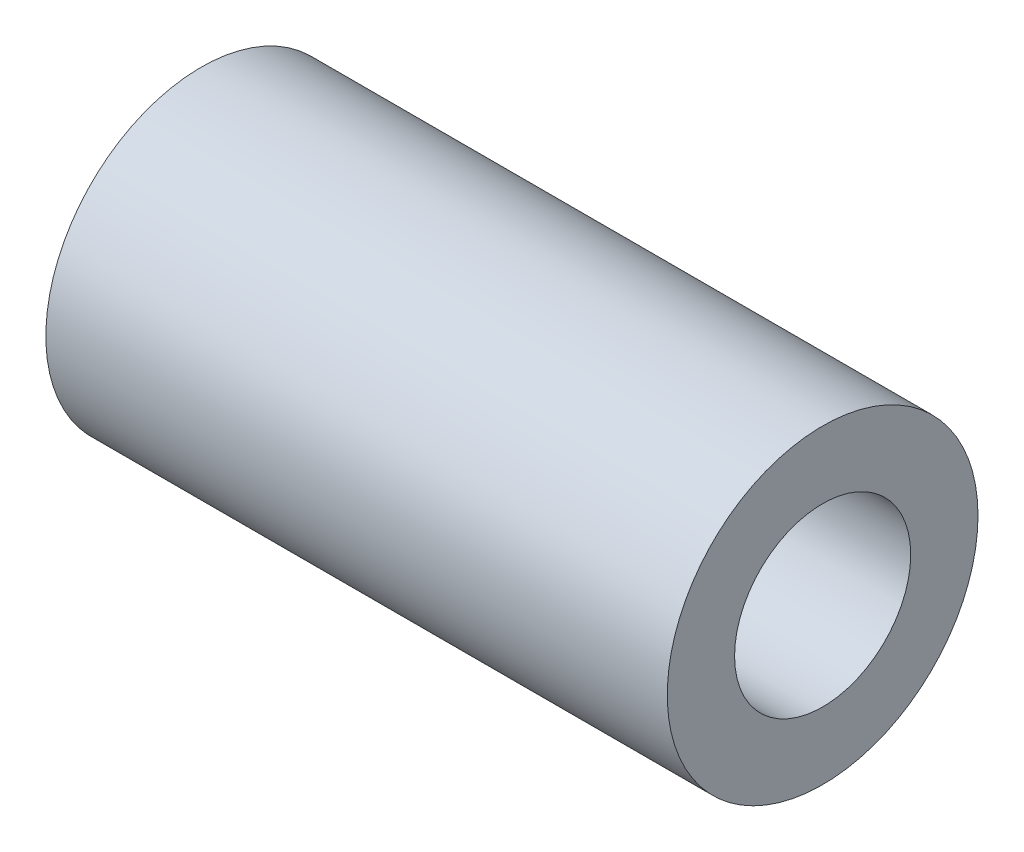
ISO-10303-21;
HEADER;
FILE_DESCRIPTION(('STEP AP214'),'2;1');
FILE_NAME('part.step','',(''),(''),'','','');
FILE_SCHEMA(('AUTOMOTIVE_DESIGN { 1 0 10303 214 1 1 1 1 }'));
ENDSEC;
DATA;
#1=APPLICATION_CONTEXT('core data for automotive mechanical design processes');
#2=APPLICATION_PROTOCOL_DEFINITION('international standard','automotive_design',2000,#1);
#3=PRODUCT_CONTEXT('',#1,'mechanical');
#4=PRODUCT('Part','Part','',(#3));
#5=PRODUCT_RELATED_PRODUCT_CATEGORY('part','',(#4));
#6=PRODUCT_DEFINITION_FORMATION('','',#4);
#7=PRODUCT_DEFINITION_CONTEXT('part definition',#1,'design');
#8=PRODUCT_DEFINITION('design','',#6,#7);
#9=PRODUCT_DEFINITION_SHAPE('','',#8);
#10=(LENGTH_UNIT() NAMED_UNIT(*) SI_UNIT(.MILLI.,.METRE.));
#11=(NAMED_UNIT(*) PLANE_ANGLE_UNIT() SI_UNIT($,.RADIAN.));
#12=(NAMED_UNIT(*) SI_UNIT($,.STERADIAN.) SOLID_ANGLE_UNIT());
#13=UNCERTAINTY_MEASURE_WITH_UNIT(LENGTH_MEASURE(1.E-05),#10,'distance_accuracy_value','');
#14=(GEOMETRIC_REPRESENTATION_CONTEXT(3) GLOBAL_UNCERTAINTY_ASSIGNED_CONTEXT((#13)) GLOBAL_UNIT_ASSIGNED_CONTEXT((#10,
#11,#12)) REPRESENTATION_CONTEXT('',''));
#15=CARTESIAN_POINT('',(0.,0.,0.));
#16=DIRECTION('',(0.,0.,1.));
#17=DIRECTION('',(1.,0.,0.));
#18=AXIS2_PLACEMENT_3D('',#15,#16,#17);
#19=CARTESIAN_POINT('',(12.7,0.,0.));
#20=DIRECTION('',(1.,0.,0.));
#21=DIRECTION('',(0.,0.,-1.));
#22=AXIS2_PLACEMENT_3D('',#19,#20,#21);
#23=PLANE('',#22);
#24=CARTESIAN_POINT('',(12.7,0.,0.));
#25=DIRECTION('',(1.,0.,0.));
#26=DIRECTION('',(0.,0.,-1.));
#27=AXIS2_PLACEMENT_3D('',#24,#25,#26);
#28=CIRCLE('',#27,3.175);
#29=CARTESIAN_POINT('',(12.7,0.,-3.175));
#30=VERTEX_POINT('',#29);
#31=EDGE_CURVE('E10',#30,#30,#28,.T.);
#32=ORIENTED_EDGE('',*,*,#31,.T.);
#33=EDGE_LOOP('',(#32));
#34=FACE_BOUND('',#33,.T.);
#35=CARTESIAN_POINT('',(12.7,0.,0.));
#36=DIRECTION('',(1.,0.,0.));
#37=DIRECTION('',(0.,0.,-1.));
#38=AXIS2_PLACEMENT_3D('',#35,#36,#37);
#39=CIRCLE('',#38,1.8);
#40=CARTESIAN_POINT('',(12.7,0.,-1.8));
#41=VERTEX_POINT('',#40);
#42=EDGE_CURVE('E42',#41,#41,#39,.T.);
#43=ORIENTED_EDGE('',*,*,#42,.F.);
#44=EDGE_LOOP('',(#43));
#45=FACE_BOUND('',#44,.T.);
#46=ADVANCED_FACE('F31',(#34,#45),#23,.T.);
#47=CARTESIAN_POINT('',(0.,0.,0.));
#48=DIRECTION('',(1.,0.,0.));
#49=DIRECTION('',(0.,0.,-1.));
#50=AXIS2_PLACEMENT_3D('',#47,#48,#49);
#51=PLANE('',#50);
#52=CARTESIAN_POINT('',(0.,0.,0.));
#53=DIRECTION('',(1.,0.,0.));
#54=DIRECTION('',(0.,0.,-1.));
#55=AXIS2_PLACEMENT_3D('',#52,#53,#54);
#56=CIRCLE('',#55,3.175);
#57=CARTESIAN_POINT('',(0.,0.,-3.175));
#58=VERTEX_POINT('',#57);
#59=EDGE_CURVE('E35',#58,#58,#56,.T.);
#60=ORIENTED_EDGE('',*,*,#59,.F.);
#61=EDGE_LOOP('',(#60));
#62=FACE_BOUND('',#61,.T.);
#63=CARTESIAN_POINT('',(0.,0.,0.));
#64=DIRECTION('',(1.,0.,0.));
#65=DIRECTION('',(0.,0.,-1.));
#66=AXIS2_PLACEMENT_3D('',#63,#64,#65);
#67=CIRCLE('',#66,1.8);
#68=CARTESIAN_POINT('',(0.,0.,-1.8));
#69=VERTEX_POINT('',#68);
#70=EDGE_CURVE('E44',#69,#69,#67,.T.);
#71=ORIENTED_EDGE('',*,*,#70,.T.);
#72=EDGE_LOOP('',(#71));
#73=FACE_BOUND('',#72,.T.);
#74=ADVANCED_FACE('F54',(#62,#73),#51,.F.);
#75=CARTESIAN_POINT('',(12.7,0.,0.));
#76=DIRECTION('',(-1.,0.,0.));
#77=DIRECTION('',(0.,0.,1.));
#78=AXIS2_PLACEMENT_3D('',#75,#76,#77);
#79=CYLINDRICAL_SURFACE('',#78,3.175);
#80=ORIENTED_EDGE('',*,*,#31,.F.);
#81=EDGE_LOOP('',(#80));
#82=FACE_BOUND('',#81,.T.);
#83=ORIENTED_EDGE('',*,*,#59,.T.);
#84=EDGE_LOOP('',(#83));
#85=FACE_BOUND('',#84,.T.);
#86=ADVANCED_FACE('F33',(#82,#85),#79,.T.);
#87=CARTESIAN_POINT('',(12.7,0.,0.));
#88=DIRECTION('',(-1.,0.,0.));
#89=DIRECTION('',(0.,0.,1.));
#90=AXIS2_PLACEMENT_3D('',#87,#88,#89);
#91=CYLINDRICAL_SURFACE('',#90,1.8);
#92=ORIENTED_EDGE('',*,*,#42,.T.);
#93=EDGE_LOOP('',(#92));
#94=FACE_BOUND('',#93,.T.);
#95=ORIENTED_EDGE('',*,*,#70,.F.);
#96=EDGE_LOOP('',(#95));
#97=FACE_BOUND('',#96,.T.);
#98=ADVANCED_FACE('F50',(#94,#97),#91,.F.);
#99=CLOSED_SHELL('',(#46,#74,#86,#98));
#100=MANIFOLD_SOLID_BREP('B2',#99);
#101=ADVANCED_BREP_SHAPE_REPRESENTATION('',(#18,#100),#14);
#102=SHAPE_DEFINITION_REPRESENTATION(#9,#101);
ENDSEC;
END-ISO-10303-21;
